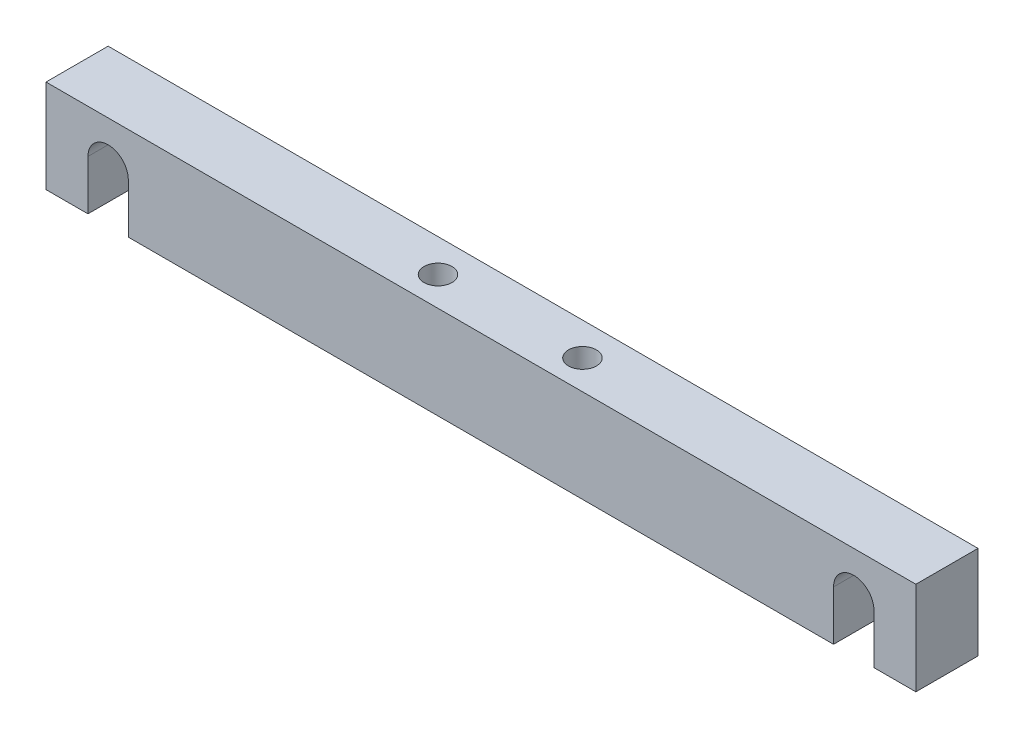
ISO-10303-21;
HEADER;
FILE_DESCRIPTION(('STEP AP214'),'2;1');
FILE_NAME('part.step','',(''),(''),'','','');
FILE_SCHEMA(('AUTOMOTIVE_DESIGN { 1 0 10303 214 1 1 1 1 }'));
ENDSEC;
DATA;
#1=APPLICATION_CONTEXT('core data for automotive mechanical design processes');
#2=APPLICATION_PROTOCOL_DEFINITION('international standard','automotive_design',2000,#1);
#3=PRODUCT_CONTEXT('',#1,'mechanical');
#4=PRODUCT('Part','Part','',(#3));
#5=PRODUCT_RELATED_PRODUCT_CATEGORY('part','',(#4));
#6=PRODUCT_DEFINITION_FORMATION('','',#4);
#7=PRODUCT_DEFINITION_CONTEXT('part definition',#1,'design');
#8=PRODUCT_DEFINITION('design','',#6,#7);
#9=PRODUCT_DEFINITION_SHAPE('','',#8);
#10=(LENGTH_UNIT() NAMED_UNIT(*) SI_UNIT(.MILLI.,.METRE.));
#11=(NAMED_UNIT(*) PLANE_ANGLE_UNIT() SI_UNIT($,.RADIAN.));
#12=(NAMED_UNIT(*) SI_UNIT($,.STERADIAN.) SOLID_ANGLE_UNIT());
#13=UNCERTAINTY_MEASURE_WITH_UNIT(LENGTH_MEASURE(1.E-05),#10,'distance_accuracy_value','');
#14=(GEOMETRIC_REPRESENTATION_CONTEXT(3) GLOBAL_UNCERTAINTY_ASSIGNED_CONTEXT((#13)) GLOBAL_UNIT_ASSIGNED_CONTEXT((#10,
#11,#12)) REPRESENTATION_CONTEXT('',''));
#15=CARTESIAN_POINT('',(0.,0.,0.));
#16=DIRECTION('',(0.,0.,1.));
#17=DIRECTION('',(1.,0.,0.));
#18=AXIS2_PLACEMENT_3D('',#15,#16,#17);
#19=CARTESIAN_POINT('',(0.,0.,0.));
#20=DIRECTION('',(0.,1.,0.));
#21=DIRECTION('',(0.,0.,1.));
#22=AXIS2_PLACEMENT_3D('',#19,#20,#21);
#23=PLANE('',#22);
#24=DIRECTION('',(-1.,0.,0.));
#25=VECTOR('',#24,1.);
#26=CARTESIAN_POINT('',(23.8744988431846,0.,-5.2865551527034));
#27=LINE('',#26,#25);
#28=CARTESIAN_POINT('',(30.6244988431846,0.,-5.2865551527034));
#29=VERTEX_POINT('',#28);
#30=CARTESIAN_POINT('',(23.8744988431846,0.,-5.2865551527034));
#31=VERTEX_POINT('',#30);
#32=EDGE_CURVE('E199',#29,#31,#27,.T.);
#33=ORIENTED_EDGE('',*,*,#32,.F.);
#34=DIRECTION('',(0.,0.,1.));
#35=VECTOR('',#34,1.);
#36=CARTESIAN_POINT('',(30.6244988431846,0.,0.));
#37=LINE('',#36,#35);
#38=CARTESIAN_POINT('',(30.6244988431846,0.,4.7134448472966));
#39=VERTEX_POINT('',#38);
#40=EDGE_CURVE('E11',#29,#39,#37,.T.);
#41=ORIENTED_EDGE('',*,*,#40,.T.);
#42=DIRECTION('',(1.,0.,0.));
#43=VECTOR('',#42,1.);
#44=CARTESIAN_POINT('',(23.8744988431846,0.,4.7134448472966));
#45=LINE('',#44,#43);
#46=CARTESIAN_POINT('',(23.8744988431846,0.,4.7134448472966));
#47=VERTEX_POINT('',#46);
#48=EDGE_CURVE('E193',#47,#39,#45,.T.);
#49=ORIENTED_EDGE('',*,*,#48,.F.);
#50=DIRECTION('',(0.,0.,1.));
#51=VECTOR('',#50,1.);
#52=CARTESIAN_POINT('',(23.8744988431846,0.,-5.2865551527034));
#53=LINE('',#52,#51);
#54=EDGE_CURVE('E178',#31,#47,#53,.T.);
#55=ORIENTED_EDGE('',*,*,#54,.F.);
#56=EDGE_LOOP('',(#33,#41,#49,#55));
#57=FACE_BOUND('',#56,.T.);
#58=ADVANCED_FACE('F36',(#57),#23,.F.);
#59=CARTESIAN_POINT('',(82.2494988431846,0.,0.));
#60=DIRECTION('',(0.,-1.,0.));
#61=DIRECTION('',(0.,0.,-1.));
#62=AXIS2_PLACEMENT_3D('',#59,#60,#61);
#63=CIRCLE('',#62,4.59);
#64=CARTESIAN_POINT('',(82.2494988431846,0.,-4.59));
#65=VERTEX_POINT('',#64);
#66=EDGE_CURVE('E297',#65,#65,#63,.T.);
#67=ORIENTED_EDGE('',*,*,#66,.F.);
#68=EDGE_LOOP('',(#67));
#69=FACE_BOUND('',#68,.T.);
#70=CARTESIAN_POINT('',(105.499498843185,0.,0.));
#71=DIRECTION('',(0.,-1.,0.));
#72=DIRECTION('',(0.,0.,-1.));
#73=AXIS2_PLACEMENT_3D('',#70,#71,#72);
#74=CIRCLE('',#73,4.59);
#75=CARTESIAN_POINT('',(105.499498843185,0.,-4.59));
#76=VERTEX_POINT('',#75);
#77=EDGE_CURVE('E288',#76,#76,#74,.T.);
#78=ORIENTED_EDGE('',*,*,#77,.F.);
#79=EDGE_LOOP('',(#78));
#80=FACE_BOUND('',#79,.T.);
#81=CARTESIAN_POINT('',(37.1244988431846,0.,4.7134448472966));
#82=VERTEX_POINT('',#81);
#83=CARTESIAN_POINT('',(150.624498843185,0.,4.7134448472966));
#84=VERTEX_POINT('',#83);
#85=EDGE_CURVE('E197',#82,#84,#45,.T.);
#86=ORIENTED_EDGE('',*,*,#85,.F.);
#87=DIRECTION('',(0.,0.,-1.));
#88=VECTOR('',#87,1.);
#89=CARTESIAN_POINT('',(37.1244988431846,0.,0.));
#90=LINE('',#89,#88);
#91=CARTESIAN_POINT('',(37.1244988431846,0.,-5.2865551527034));
#92=VERTEX_POINT('',#91);
#93=EDGE_CURVE('E44',#82,#92,#90,.T.);
#94=ORIENTED_EDGE('',*,*,#93,.T.);
#95=CARTESIAN_POINT('',(150.624498843185,0.,-5.2865551527034));
#96=VERTEX_POINT('',#95);
#97=EDGE_CURVE('E146',#96,#92,#27,.T.);
#98=ORIENTED_EDGE('',*,*,#97,.F.);
#99=DIRECTION('',(0.,0.,1.));
#100=VECTOR('',#99,1.);
#101=CARTESIAN_POINT('',(150.624498843185,0.,0.));
#102=LINE('',#101,#100);
#103=EDGE_CURVE('E215',#96,#84,#102,.T.);
#104=ORIENTED_EDGE('',*,*,#103,.T.);
#105=EDGE_LOOP('',(#86,#94,#98,#104));
#106=FACE_BOUND('',#105,.T.);
#107=ADVANCED_FACE('F219',(#69,#80,#106),#23,.F.);
#108=CARTESIAN_POINT('',(23.8744988431846,15.,-5.2865551527034));
#109=DIRECTION('',(1.,0.,0.));
#110=DIRECTION('',(0.,0.,-1.));
#111=AXIS2_PLACEMENT_3D('',#108,#109,#110);
#112=PLANE('',#111);
#113=ORIENTED_EDGE('',*,*,#54,.T.);
#114=DIRECTION('',(0.,-1.,0.));
#115=VECTOR('',#114,1.);
#116=CARTESIAN_POINT('',(23.8744988431846,15.,4.7134448472966));
#117=LINE('',#116,#115);
#118=CARTESIAN_POINT('',(23.8744988431846,15.,4.7134448472966));
#119=VERTEX_POINT('',#118);
#120=EDGE_CURVE('E210',#119,#47,#117,.T.);
#121=ORIENTED_EDGE('',*,*,#120,.F.);
#122=DIRECTION('',(0.,0.,1.));
#123=VECTOR('',#122,1.);
#124=CARTESIAN_POINT('',(23.8744988431846,15.,-5.2865551527034));
#125=LINE('',#124,#123);
#126=CARTESIAN_POINT('',(23.8744988431846,15.,-5.2865551527034));
#127=VERTEX_POINT('',#126);
#128=EDGE_CURVE('E179',#127,#119,#125,.T.);
#129=ORIENTED_EDGE('',*,*,#128,.F.);
#130=DIRECTION('',(0.,-1.,0.));
#131=VECTOR('',#130,1.);
#132=CARTESIAN_POINT('',(23.8744988431846,15.,-5.2865551527034));
#133=LINE('',#132,#131);
#134=EDGE_CURVE('E189',#127,#31,#133,.T.);
#135=ORIENTED_EDGE('',*,*,#134,.T.);
#136=EDGE_LOOP('',(#113,#121,#129,#135));
#137=FACE_BOUND('',#136,.T.);
#138=ADVANCED_FACE('F38',(#137),#112,.F.);
#139=CARTESIAN_POINT('',(23.8744988431846,15.,4.7134448472966));
#140=DIRECTION('',(0.,0.,-1.));
#141=DIRECTION('',(-1.,0.,0.));
#142=AXIS2_PLACEMENT_3D('',#139,#140,#141);
#143=PLANE('',#142);
#144=ORIENTED_EDGE('',*,*,#48,.T.);
#145=DIRECTION('',(0.,1.,0.));
#146=VECTOR('',#145,1.);
#147=CARTESIAN_POINT('',(30.6244988431846,15.,4.7134448472966));
#148=LINE('',#147,#146);
#149=CARTESIAN_POINT('',(30.6244988431846,8.,4.7134448472966));
#150=VERTEX_POINT('',#149);
#151=EDGE_CURVE('E170',#39,#150,#148,.T.);
#152=ORIENTED_EDGE('',*,*,#151,.T.);
#153=CARTESIAN_POINT('',(33.8744988431846,8.,4.7134448472966));
#154=DIRECTION('',(0.,0.,-1.));
#155=DIRECTION('',(-1.,0.,0.));
#156=AXIS2_PLACEMENT_3D('',#153,#154,#155);
#157=CIRCLE('',#156,3.25);
#158=CARTESIAN_POINT('',(37.1244988431846,8.,4.7134448472966));
#159=VERTEX_POINT('',#158);
#160=EDGE_CURVE('E176',#150,#159,#157,.T.);
#161=ORIENTED_EDGE('',*,*,#160,.T.);
#162=DIRECTION('',(0.,-1.,0.));
#163=VECTOR('',#162,1.);
#164=CARTESIAN_POINT('',(37.1244988431847,15.,4.7134448472966));
#165=LINE('',#164,#163);
#166=EDGE_CURVE('E127',#159,#82,#165,.T.);
#167=ORIENTED_EDGE('',*,*,#166,.T.);
#168=ORIENTED_EDGE('',*,*,#85,.T.);
#169=DIRECTION('',(0.,1.,0.));
#170=VECTOR('',#169,1.);
#171=CARTESIAN_POINT('',(150.624498843185,15.,4.7134448472966));
#172=LINE('',#171,#170);
#173=CARTESIAN_POINT('',(150.624498843185,8.,4.7134448472966));
#174=VERTEX_POINT('',#173);
#175=EDGE_CURVE('E166',#84,#174,#172,.T.);
#176=ORIENTED_EDGE('',*,*,#175,.T.);
#177=CARTESIAN_POINT('',(153.874498843185,8.,4.7134448472966));
#178=DIRECTION('',(0.,0.,-1.));
#179=DIRECTION('',(-1.,0.,0.));
#180=AXIS2_PLACEMENT_3D('',#177,#178,#179);
#181=CIRCLE('',#180,3.25);
#182=CARTESIAN_POINT('',(157.124498843185,8.,4.7134448472966));
#183=VERTEX_POINT('',#182);
#184=EDGE_CURVE('E173',#174,#183,#181,.T.);
#185=ORIENTED_EDGE('',*,*,#184,.T.);
#186=DIRECTION('',(0.,-1.,0.));
#187=VECTOR('',#186,1.);
#188=CARTESIAN_POINT('',(157.124498843185,15.,4.7134448472966));
#189=LINE('',#188,#187);
#190=CARTESIAN_POINT('',(157.124498843185,0.,4.7134448472966));
#191=VERTEX_POINT('',#190);
#192=EDGE_CURVE('E151',#183,#191,#189,.T.);
#193=ORIENTED_EDGE('',*,*,#192,.T.);
#194=CARTESIAN_POINT('',(163.874498843185,0.,4.7134448472966));
#195=VERTEX_POINT('',#194);
#196=EDGE_CURVE('E192',#191,#195,#45,.T.);
#197=ORIENTED_EDGE('',*,*,#196,.T.);
#198=DIRECTION('',(0.,-1.,0.));
#199=VECTOR('',#198,1.);
#200=CARTESIAN_POINT('',(163.874498843185,15.,4.7134448472966));
#201=LINE('',#200,#199);
#202=CARTESIAN_POINT('',(163.874498843185,15.,4.7134448472966));
#203=VERTEX_POINT('',#202);
#204=EDGE_CURVE('E207',#203,#195,#201,.T.);
#205=ORIENTED_EDGE('',*,*,#204,.F.);
#206=DIRECTION('',(1.,0.,0.));
#207=VECTOR('',#206,1.);
#208=CARTESIAN_POINT('',(23.8744988431846,15.,4.7134448472966));
#209=LINE('',#208,#207);
#210=EDGE_CURVE('E182',#119,#203,#209,.T.);
#211=ORIENTED_EDGE('',*,*,#210,.F.);
#212=ORIENTED_EDGE('',*,*,#120,.T.);
#213=EDGE_LOOP('',(#144,#152,#161,#167,#168,#176,#185,#193,#197,#205,#211,#212));
#214=FACE_BOUND('',#213,.T.);
#215=ADVANCED_FACE('F222',(#214),#143,.F.);
#216=CARTESIAN_POINT('',(163.874498843185,15.,-5.2865551527034));
#217=DIRECTION('',(-1.,0.,0.));
#218=DIRECTION('',(0.,0.,1.));
#219=AXIS2_PLACEMENT_3D('',#216,#217,#218);
#220=PLANE('',#219);
#221=DIRECTION('',(0.,0.,-1.));
#222=VECTOR('',#221,1.);
#223=CARTESIAN_POINT('',(163.874498843185,0.,-5.2865551527034));
#224=LINE('',#223,#222);
#225=CARTESIAN_POINT('',(163.874498843185,0.,-5.2865551527034));
#226=VERTEX_POINT('',#225);
#227=EDGE_CURVE('E196',#195,#226,#224,.T.);
#228=ORIENTED_EDGE('',*,*,#227,.T.);
#229=DIRECTION('',(0.,-1.,0.));
#230=VECTOR('',#229,1.);
#231=CARTESIAN_POINT('',(163.874498843185,15.,-5.2865551527034));
#232=LINE('',#231,#230);
#233=CARTESIAN_POINT('',(163.874498843185,15.,-5.2865551527034));
#234=VERTEX_POINT('',#233);
#235=EDGE_CURVE('E204',#234,#226,#232,.T.);
#236=ORIENTED_EDGE('',*,*,#235,.F.);
#237=DIRECTION('',(0.,0.,-1.));
#238=VECTOR('',#237,1.);
#239=CARTESIAN_POINT('',(163.874498843185,15.,-5.2865551527034));
#240=LINE('',#239,#238);
#241=EDGE_CURVE('E185',#203,#234,#240,.T.);
#242=ORIENTED_EDGE('',*,*,#241,.F.);
#243=ORIENTED_EDGE('',*,*,#204,.T.);
#244=EDGE_LOOP('',(#228,#236,#242,#243));
#245=FACE_BOUND('',#244,.T.);
#246=ADVANCED_FACE('F240',(#245),#220,.F.);
#247=CARTESIAN_POINT('',(23.8744988431846,15.,-5.2865551527034));
#248=DIRECTION('',(0.,0.,1.));
#249=DIRECTION('',(1.,0.,0.));
#250=AXIS2_PLACEMENT_3D('',#247,#248,#249);
#251=PLANE('',#250);
#252=CARTESIAN_POINT('',(33.8744988431846,8.,-5.2865551527034));
#253=DIRECTION('',(0.,0.,-1.));
#254=DIRECTION('',(-1.,0.,0.));
#255=AXIS2_PLACEMENT_3D('',#252,#253,#254);
#256=CIRCLE('',#255,3.25);
#257=CARTESIAN_POINT('',(30.6244988431846,8.,-5.2865551527034));
#258=VERTEX_POINT('',#257);
#259=CARTESIAN_POINT('',(37.1244988431846,8.,-5.2865551527034));
#260=VERTEX_POINT('',#259);
#261=EDGE_CURVE('E134',#258,#260,#256,.T.);
#262=ORIENTED_EDGE('',*,*,#261,.F.);
#263=DIRECTION('',(0.,1.,0.));
#264=VECTOR('',#263,1.);
#265=CARTESIAN_POINT('',(30.6244988431846,0.,-5.2865551527034));
#266=LINE('',#265,#264);
#267=EDGE_CURVE('E131',#29,#258,#266,.T.);
#268=ORIENTED_EDGE('',*,*,#267,.F.);
#269=ORIENTED_EDGE('',*,*,#32,.T.);
#270=ORIENTED_EDGE('',*,*,#134,.F.);
#271=DIRECTION('',(-1.,0.,0.));
#272=VECTOR('',#271,1.);
#273=CARTESIAN_POINT('',(23.8744988431846,15.,-5.2865551527034));
#274=LINE('',#273,#272);
#275=EDGE_CURVE('E187',#234,#127,#274,.T.);
#276=ORIENTED_EDGE('',*,*,#275,.F.);
#277=ORIENTED_EDGE('',*,*,#235,.T.);
#278=CARTESIAN_POINT('',(157.124498843185,0.,-5.2865551527034));
#279=VERTEX_POINT('',#278);
#280=EDGE_CURVE('E183',#226,#279,#27,.T.);
#281=ORIENTED_EDGE('',*,*,#280,.T.);
#282=DIRECTION('',(0.,-1.,0.));
#283=VECTOR('',#282,1.);
#284=CARTESIAN_POINT('',(157.124498843185,8.,-5.2865551527034));
#285=LINE('',#284,#283);
#286=CARTESIAN_POINT('',(157.124498843185,8.,-5.2865551527034));
#287=VERTEX_POINT('',#286);
#288=EDGE_CURVE('E59',#287,#279,#285,.T.);
#289=ORIENTED_EDGE('',*,*,#288,.F.);
#290=CARTESIAN_POINT('',(153.874498843185,8.,-5.2865551527034));
#291=DIRECTION('',(0.,0.,-1.));
#292=DIRECTION('',(-1.,0.,0.));
#293=AXIS2_PLACEMENT_3D('',#290,#291,#292);
#294=CIRCLE('',#293,3.25);
#295=CARTESIAN_POINT('',(150.624498843185,8.,-5.2865551527034));
#296=VERTEX_POINT('',#295);
#297=EDGE_CURVE('E153',#296,#287,#294,.T.);
#298=ORIENTED_EDGE('',*,*,#297,.F.);
#299=DIRECTION('',(0.,1.,0.));
#300=VECTOR('',#299,1.);
#301=CARTESIAN_POINT('',(150.624498843185,-0.120378635134403,-5.2865551527034));
#302=LINE('',#301,#300);
#303=EDGE_CURVE('E158',#96,#296,#302,.T.);
#304=ORIENTED_EDGE('',*,*,#303,.F.);
#305=ORIENTED_EDGE('',*,*,#97,.T.);
#306=DIRECTION('',(0.,-1.,0.));
#307=VECTOR('',#306,1.);
#308=CARTESIAN_POINT('',(37.1244988431846,8.,-5.2865551527034));
#309=LINE('',#308,#307);
#310=EDGE_CURVE('E51',#260,#92,#309,.T.);
#311=ORIENTED_EDGE('',*,*,#310,.F.);
#312=EDGE_LOOP('',(#262,#268,#269,#270,#276,#277,#281,#289,#298,#304,#305,#311));
#313=FACE_BOUND('',#312,.T.);
#314=ADVANCED_FACE('F143',(#313),#251,.F.);
#315=CARTESIAN_POINT('',(0.,15.,0.));
#316=DIRECTION('',(0.,1.,0.));
#317=DIRECTION('',(0.,0.,1.));
#318=AXIS2_PLACEMENT_3D('',#315,#316,#317);
#319=PLANE('',#318);
#320=CARTESIAN_POINT('',(82.2494988431846,15.,0.));
#321=DIRECTION('',(0.,-1.,0.));
#322=DIRECTION('',(0.,0.,-1.));
#323=AXIS2_PLACEMENT_3D('',#320,#321,#322);
#324=CIRCLE('',#323,2.24999999999999);
#325=CARTESIAN_POINT('',(82.2494988431846,15.,-2.24999999999999));
#326=VERTEX_POINT('',#325);
#327=EDGE_CURVE('E282',#326,#326,#324,.T.);
#328=ORIENTED_EDGE('',*,*,#327,.T.);
#329=EDGE_LOOP('',(#328));
#330=FACE_BOUND('',#329,.T.);
#331=CARTESIAN_POINT('',(105.499498843185,15.,0.));
#332=DIRECTION('',(0.,-1.,0.));
#333=DIRECTION('',(0.,0.,-1.));
#334=AXIS2_PLACEMENT_3D('',#331,#332,#333);
#335=CIRCLE('',#334,2.24999999999999);
#336=CARTESIAN_POINT('',(105.499498843185,15.,-2.24999999999999));
#337=VERTEX_POINT('',#336);
#338=EDGE_CURVE('E156',#337,#337,#335,.T.);
#339=ORIENTED_EDGE('',*,*,#338,.T.);
#340=EDGE_LOOP('',(#339));
#341=FACE_BOUND('',#340,.T.);
#342=ORIENTED_EDGE('',*,*,#128,.T.);
#343=ORIENTED_EDGE('',*,*,#210,.T.);
#344=ORIENTED_EDGE('',*,*,#241,.T.);
#345=ORIENTED_EDGE('',*,*,#275,.T.);
#346=EDGE_LOOP('',(#342,#343,#344,#345));
#347=FACE_BOUND('',#346,.T.);
#348=ADVANCED_FACE('F236',(#330,#341,#347),#319,.T.);
#349=ORIENTED_EDGE('',*,*,#196,.F.);
#350=DIRECTION('',(0.,0.,-1.));
#351=VECTOR('',#350,1.);
#352=CARTESIAN_POINT('',(157.124498843185,0.,0.));
#353=LINE('',#352,#351);
#354=EDGE_CURVE('E213',#191,#279,#353,.T.);
#355=ORIENTED_EDGE('',*,*,#354,.T.);
#356=ORIENTED_EDGE('',*,*,#280,.F.);
#357=ORIENTED_EDGE('',*,*,#227,.F.);
#358=EDGE_LOOP('',(#349,#355,#356,#357));
#359=FACE_BOUND('',#358,.T.);
#360=ADVANCED_FACE('F244',(#359),#23,.F.);
#361=CARTESIAN_POINT('',(153.874498843185,8.,9.7134448472966));
#362=DIRECTION('',(0.,0.,-1.));
#363=DIRECTION('',(-1.,0.,0.));
#364=AXIS2_PLACEMENT_3D('',#361,#362,#363);
#365=CYLINDRICAL_SURFACE('',#364,3.25);
#366=DIRECTION('',(0.,0.,-1.));
#367=VECTOR('',#366,1.);
#368=CARTESIAN_POINT('',(150.624498843185,8.,9.7134448472966));
#369=LINE('',#368,#367);
#370=EDGE_CURVE('E140',#174,#296,#369,.T.);
#371=ORIENTED_EDGE('',*,*,#370,.T.);
#372=ORIENTED_EDGE('',*,*,#297,.T.);
#373=DIRECTION('',(0.,0.,-1.));
#374=VECTOR('',#373,1.);
#375=CARTESIAN_POINT('',(157.124498843185,8.,9.7134448472966));
#376=LINE('',#375,#374);
#377=EDGE_CURVE('E161',#183,#287,#376,.T.);
#378=ORIENTED_EDGE('',*,*,#377,.F.);
#379=ORIENTED_EDGE('',*,*,#184,.F.);
#380=EDGE_LOOP('',(#371,#372,#378,#379));
#381=FACE_BOUND('',#380,.T.);
#382=ADVANCED_FACE('F248',(#381),#365,.F.);
#383=CARTESIAN_POINT('',(150.624498843185,-0.120378635134403,9.7134448472966));
#384=DIRECTION('',(-1.,0.,0.));
#385=DIRECTION('',(0.,0.,1.));
#386=AXIS2_PLACEMENT_3D('',#383,#384,#385);
#387=PLANE('',#386);
#388=ORIENTED_EDGE('',*,*,#103,.F.);
#389=ORIENTED_EDGE('',*,*,#303,.T.);
#390=ORIENTED_EDGE('',*,*,#370,.F.);
#391=ORIENTED_EDGE('',*,*,#175,.F.);
#392=EDGE_LOOP('',(#388,#389,#390,#391));
#393=FACE_BOUND('',#392,.T.);
#394=ADVANCED_FACE('F251',(#393),#387,.F.);
#395=CARTESIAN_POINT('',(157.124498843185,8.,9.7134448472966));
#396=DIRECTION('',(1.,0.,0.));
#397=DIRECTION('',(0.,0.,-1.));
#398=AXIS2_PLACEMENT_3D('',#395,#396,#397);
#399=PLANE('',#398);
#400=ORIENTED_EDGE('',*,*,#377,.T.);
#401=ORIENTED_EDGE('',*,*,#288,.T.);
#402=ORIENTED_EDGE('',*,*,#354,.F.);
#403=ORIENTED_EDGE('',*,*,#192,.F.);
#404=EDGE_LOOP('',(#400,#401,#402,#403));
#405=FACE_BOUND('',#404,.T.);
#406=ADVANCED_FACE('F252',(#405),#399,.F.);
#407=CARTESIAN_POINT('',(33.8744988431846,8.,9.7134448472966));
#408=DIRECTION('',(0.,0.,-1.));
#409=DIRECTION('',(-1.,0.,0.));
#410=AXIS2_PLACEMENT_3D('',#407,#408,#409);
#411=CYLINDRICAL_SURFACE('',#410,3.25);
#412=DIRECTION('',(0.,0.,-1.));
#413=VECTOR('',#412,1.);
#414=CARTESIAN_POINT('',(30.6244988431846,8.,9.7134448472966));
#415=LINE('',#414,#413);
#416=EDGE_CURVE('E130',#150,#258,#415,.T.);
#417=ORIENTED_EDGE('',*,*,#416,.T.);
#418=ORIENTED_EDGE('',*,*,#261,.T.);
#419=DIRECTION('',(0.,0.,-1.));
#420=VECTOR('',#419,1.);
#421=CARTESIAN_POINT('',(37.1244988431846,8.,9.7134448472966));
#422=LINE('',#421,#420);
#423=EDGE_CURVE('E123',#159,#260,#422,.T.);
#424=ORIENTED_EDGE('',*,*,#423,.F.);
#425=ORIENTED_EDGE('',*,*,#160,.F.);
#426=EDGE_LOOP('',(#417,#418,#424,#425));
#427=FACE_BOUND('',#426,.T.);
#428=ADVANCED_FACE('F135',(#427),#411,.F.);
#429=CARTESIAN_POINT('',(30.6244988431846,0.,9.7134448472966));
#430=DIRECTION('',(-1.,0.,0.));
#431=DIRECTION('',(0.,-1.,0.));
#432=AXIS2_PLACEMENT_3D('',#429,#430,#431);
#433=PLANE('',#432);
#434=ORIENTED_EDGE('',*,*,#40,.F.);
#435=ORIENTED_EDGE('',*,*,#267,.T.);
#436=ORIENTED_EDGE('',*,*,#416,.F.);
#437=ORIENTED_EDGE('',*,*,#151,.F.);
#438=EDGE_LOOP('',(#434,#435,#436,#437));
#439=FACE_BOUND('',#438,.T.);
#440=ADVANCED_FACE('F224',(#439),#433,.F.);
#441=CARTESIAN_POINT('',(37.1244988431846,8.,9.7134448472966));
#442=DIRECTION('',(1.,0.,0.));
#443=DIRECTION('',(0.,1.,0.));
#444=AXIS2_PLACEMENT_3D('',#441,#442,#443);
#445=PLANE('',#444);
#446=ORIENTED_EDGE('',*,*,#423,.T.);
#447=ORIENTED_EDGE('',*,*,#310,.T.);
#448=ORIENTED_EDGE('',*,*,#93,.F.);
#449=ORIENTED_EDGE('',*,*,#166,.F.);
#450=EDGE_LOOP('',(#446,#447,#448,#449));
#451=FACE_BOUND('',#450,.T.);
#452=ADVANCED_FACE('F125',(#451),#445,.F.);
#453=CARTESIAN_POINT('',(105.499498843185,0.,0.));
#454=DIRECTION('',(0.,-1.,0.));
#455=DIRECTION('',(0.,0.,-1.));
#456=AXIS2_PLACEMENT_3D('',#453,#454,#455);
#457=CYLINDRICAL_SURFACE('',#456,2.25);
#458=ORIENTED_EDGE('',*,*,#338,.F.);
#459=EDGE_LOOP('',(#458));
#460=FACE_BOUND('',#459,.T.);
#461=CARTESIAN_POINT('',(105.499498843185,2.34,0.));
#462=DIRECTION('',(0.,-1.,0.));
#463=DIRECTION('',(0.,0.,-1.));
#464=AXIS2_PLACEMENT_3D('',#461,#462,#463);
#465=CIRCLE('',#464,2.25);
#466=CARTESIAN_POINT('',(105.499498843185,2.34,-2.25));
#467=VERTEX_POINT('',#466);
#468=EDGE_CURVE('E286',#467,#467,#465,.T.);
#469=ORIENTED_EDGE('',*,*,#468,.T.);
#470=EDGE_LOOP('',(#469));
#471=FACE_BOUND('',#470,.T.);
#472=ADVANCED_FACE('F308',(#460,#471),#457,.F.);
#473=CARTESIAN_POINT('',(105.499498843185,0.,0.));
#474=DIRECTION('',(0.,-1.,0.));
#475=DIRECTION('',(0.,0.,-1.));
#476=AXIS2_PLACEMENT_3D('',#473,#474,#475);
#477=CONICAL_SURFACE('',#476,4.59,0.785398163397447);
#478=ORIENTED_EDGE('',*,*,#468,.F.);
#479=EDGE_LOOP('',(#478));
#480=FACE_BOUND('',#479,.T.);
#481=ORIENTED_EDGE('',*,*,#77,.T.);
#482=EDGE_LOOP('',(#481));
#483=FACE_BOUND('',#482,.T.);
#484=ADVANCED_FACE('F305',(#480,#483),#477,.F.);
#485=CARTESIAN_POINT('',(82.2494988431846,0.,0.));
#486=DIRECTION('',(0.,-1.,0.));
#487=DIRECTION('',(0.,0.,-1.));
#488=AXIS2_PLACEMENT_3D('',#485,#486,#487);
#489=CYLINDRICAL_SURFACE('',#488,2.25);
#490=ORIENTED_EDGE('',*,*,#327,.F.);
#491=EDGE_LOOP('',(#490));
#492=FACE_BOUND('',#491,.T.);
#493=CARTESIAN_POINT('',(82.2494988431846,2.34,0.));
#494=DIRECTION('',(0.,-1.,0.));
#495=DIRECTION('',(0.,0.,-1.));
#496=AXIS2_PLACEMENT_3D('',#493,#494,#495);
#497=CIRCLE('',#496,2.25);
#498=CARTESIAN_POINT('',(82.2494988431846,2.34,-2.25));
#499=VERTEX_POINT('',#498);
#500=EDGE_CURVE('E294',#499,#499,#497,.T.);
#501=ORIENTED_EDGE('',*,*,#500,.T.);
#502=EDGE_LOOP('',(#501));
#503=FACE_BOUND('',#502,.T.);
#504=ADVANCED_FACE('F307',(#492,#503),#489,.F.);
#505=CARTESIAN_POINT('',(82.2494988431846,0.,0.));
#506=DIRECTION('',(0.,-1.,0.));
#507=DIRECTION('',(0.,0.,-1.));
#508=AXIS2_PLACEMENT_3D('',#505,#506,#507);
#509=CONICAL_SURFACE('',#508,4.59,0.785398163397447);
#510=ORIENTED_EDGE('',*,*,#500,.F.);
#511=EDGE_LOOP('',(#510));
#512=FACE_BOUND('',#511,.T.);
#513=ORIENTED_EDGE('',*,*,#66,.T.);
#514=EDGE_LOOP('',(#513));
#515=FACE_BOUND('',#514,.T.);
#516=ADVANCED_FACE('F301',(#512,#515),#509,.F.);
#517=CLOSED_SHELL('',(#58,#107,#138,#215,#246,#314,#348,#360,#382,#394,#406,#428,#440,#452,#472,
#484,#504,#516));
#518=MANIFOLD_SOLID_BREP('B2',#517);
#519=ADVANCED_BREP_SHAPE_REPRESENTATION('',(#18,#518),#14);
#520=SHAPE_DEFINITION_REPRESENTATION(#9,#519);
ENDSEC;
END-ISO-10303-21;
